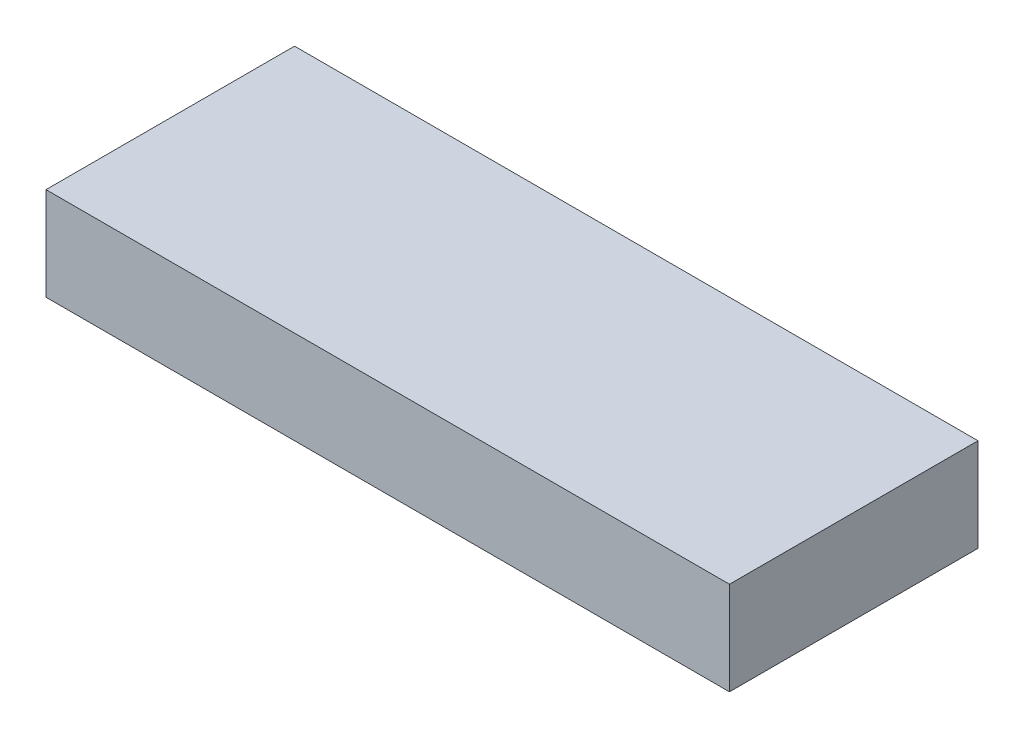
ISO-10303-21;
HEADER;
FILE_DESCRIPTION(('STEP AP214'),'2;1');
FILE_NAME('part.step','',(''),(''),'','','');
FILE_SCHEMA(('AUTOMOTIVE_DESIGN { 1 0 10303 214 1 1 1 1 }'));
ENDSEC;
DATA;
#1=APPLICATION_CONTEXT('core data for automotive mechanical design processes');
#2=APPLICATION_PROTOCOL_DEFINITION('international standard','automotive_design',2000,#1);
#3=PRODUCT_CONTEXT('',#1,'mechanical');
#4=PRODUCT('Part','Part','',(#3));
#5=PRODUCT_RELATED_PRODUCT_CATEGORY('part','',(#4));
#6=PRODUCT_DEFINITION_FORMATION('','',#4);
#7=PRODUCT_DEFINITION_CONTEXT('part definition',#1,'design');
#8=PRODUCT_DEFINITION('design','',#6,#7);
#9=PRODUCT_DEFINITION_SHAPE('','',#8);
#10=(LENGTH_UNIT() NAMED_UNIT(*) SI_UNIT(.MILLI.,.METRE.));
#11=(NAMED_UNIT(*) PLANE_ANGLE_UNIT() SI_UNIT($,.RADIAN.));
#12=(NAMED_UNIT(*) SI_UNIT($,.STERADIAN.) SOLID_ANGLE_UNIT());
#13=UNCERTAINTY_MEASURE_WITH_UNIT(LENGTH_MEASURE(1.E-05),#10,'distance_accuracy_value','');
#14=(GEOMETRIC_REPRESENTATION_CONTEXT(3) GLOBAL_UNCERTAINTY_ASSIGNED_CONTEXT((#13)) GLOBAL_UNIT_ASSIGNED_CONTEXT((#10,
#11,#12)) REPRESENTATION_CONTEXT('',''));
#15=CARTESIAN_POINT('',(0.,0.,0.));
#16=DIRECTION('',(0.,0.,1.));
#17=DIRECTION('',(1.,0.,0.));
#18=AXIS2_PLACEMENT_3D('',#15,#16,#17);
#19=CARTESIAN_POINT('',(-1100.,300.,400.));
#20=DIRECTION('',(1.,0.,0.));
#21=DIRECTION('',(0.,0.,-1.));
#22=AXIS2_PLACEMENT_3D('',#19,#20,#21);
#23=PLANE('',#22);
#24=DIRECTION('',(0.,0.,1.));
#25=VECTOR('',#24,1.);
#26=CARTESIAN_POINT('',(-1100.,0.,400.));
#27=LINE('',#26,#25);
#28=CARTESIAN_POINT('',(-1100.,0.,-400.));
#29=VERTEX_POINT('',#28);
#30=CARTESIAN_POINT('',(-1100.,0.,400.));
#31=VERTEX_POINT('',#30);
#32=EDGE_CURVE('E97',#29,#31,#27,.T.);
#33=ORIENTED_EDGE('',*,*,#32,.T.);
#34=DIRECTION('',(0.,-1.,0.));
#35=VECTOR('',#34,1.);
#36=CARTESIAN_POINT('',(-1100.,300.,400.));
#37=LINE('',#36,#35);
#38=CARTESIAN_POINT('',(-1100.,300.,400.));
#39=VERTEX_POINT('',#38);
#40=EDGE_CURVE('E11',#39,#31,#37,.T.);
#41=ORIENTED_EDGE('',*,*,#40,.F.);
#42=DIRECTION('',(0.,0.,1.));
#43=VECTOR('',#42,1.);
#44=CARTESIAN_POINT('',(-1100.,300.,400.));
#45=LINE('',#44,#43);
#46=CARTESIAN_POINT('',(-1100.,300.,-400.));
#47=VERTEX_POINT('',#46);
#48=EDGE_CURVE('E85',#47,#39,#45,.T.);
#49=ORIENTED_EDGE('',*,*,#48,.F.);
#50=DIRECTION('',(0.,-1.,0.));
#51=VECTOR('',#50,1.);
#52=CARTESIAN_POINT('',(-1100.,300.,-400.));
#53=LINE('',#52,#51);
#54=EDGE_CURVE('E93',#47,#29,#53,.T.);
#55=ORIENTED_EDGE('',*,*,#54,.T.);
#56=EDGE_LOOP('',(#33,#41,#49,#55));
#57=FACE_BOUND('',#56,.T.);
#58=ADVANCED_FACE('F34',(#57),#23,.F.);
#59=CARTESIAN_POINT('',(1100.,300.,400.));
#60=DIRECTION('',(0.,0.,-1.));
#61=DIRECTION('',(-1.,0.,0.));
#62=AXIS2_PLACEMENT_3D('',#59,#60,#61);
#63=PLANE('',#62);
#64=DIRECTION('',(1.,0.,0.));
#65=VECTOR('',#64,1.);
#66=CARTESIAN_POINT('',(1100.,0.,400.));
#67=LINE('',#66,#65);
#68=CARTESIAN_POINT('',(1100.,0.,400.));
#69=VERTEX_POINT('',#68);
#70=EDGE_CURVE('E89',#31,#69,#67,.T.);
#71=ORIENTED_EDGE('',*,*,#70,.T.);
#72=DIRECTION('',(0.,-1.,0.));
#73=VECTOR('',#72,1.);
#74=CARTESIAN_POINT('',(1100.,300.,400.));
#75=LINE('',#74,#73);
#76=CARTESIAN_POINT('',(1100.,300.,400.));
#77=VERTEX_POINT('',#76);
#78=EDGE_CURVE('E42',#77,#69,#75,.T.);
#79=ORIENTED_EDGE('',*,*,#78,.F.);
#80=DIRECTION('',(1.,0.,0.));
#81=VECTOR('',#80,1.);
#82=CARTESIAN_POINT('',(1100.,300.,400.));
#83=LINE('',#82,#81);
#84=EDGE_CURVE('E80',#39,#77,#83,.T.);
#85=ORIENTED_EDGE('',*,*,#84,.F.);
#86=ORIENTED_EDGE('',*,*,#40,.T.);
#87=EDGE_LOOP('',(#71,#79,#85,#86));
#88=FACE_BOUND('',#87,.T.);
#89=ADVANCED_FACE('F88',(#88),#63,.F.);
#90=CARTESIAN_POINT('',(1100.,300.,400.));
#91=DIRECTION('',(-1.,0.,0.));
#92=DIRECTION('',(0.,0.,1.));
#93=AXIS2_PLACEMENT_3D('',#90,#91,#92);
#94=PLANE('',#93);
#95=DIRECTION('',(0.,0.,-1.));
#96=VECTOR('',#95,1.);
#97=CARTESIAN_POINT('',(1100.,0.,400.));
#98=LINE('',#97,#96);
#99=CARTESIAN_POINT('',(1100.,0.,-400.));
#100=VERTEX_POINT('',#99);
#101=EDGE_CURVE('E67',#69,#100,#98,.T.);
#102=ORIENTED_EDGE('',*,*,#101,.T.);
#103=DIRECTION('',(0.,-1.,0.));
#104=VECTOR('',#103,1.);
#105=CARTESIAN_POINT('',(1100.,300.,-400.));
#106=LINE('',#105,#104);
#107=CARTESIAN_POINT('',(1100.,300.,-400.));
#108=VERTEX_POINT('',#107);
#109=EDGE_CURVE('E90',#108,#100,#106,.T.);
#110=ORIENTED_EDGE('',*,*,#109,.F.);
#111=DIRECTION('',(0.,0.,-1.));
#112=VECTOR('',#111,1.);
#113=CARTESIAN_POINT('',(1100.,300.,400.));
#114=LINE('',#113,#112);
#115=EDGE_CURVE('E83',#77,#108,#114,.T.);
#116=ORIENTED_EDGE('',*,*,#115,.F.);
#117=ORIENTED_EDGE('',*,*,#78,.T.);
#118=EDGE_LOOP('',(#102,#110,#116,#117));
#119=FACE_BOUND('',#118,.T.);
#120=ADVANCED_FACE('F91',(#119),#94,.F.);
#121=CARTESIAN_POINT('',(1100.,300.,-400.));
#122=DIRECTION('',(0.,0.,1.));
#123=DIRECTION('',(1.,0.,0.));
#124=AXIS2_PLACEMENT_3D('',#121,#122,#123);
#125=PLANE('',#124);
#126=DIRECTION('',(-1.,0.,0.));
#127=VECTOR('',#126,1.);
#128=CARTESIAN_POINT('',(1100.,0.,-400.));
#129=LINE('',#128,#127);
#130=EDGE_CURVE('E73',#100,#29,#129,.T.);
#131=ORIENTED_EDGE('',*,*,#130,.T.);
#132=ORIENTED_EDGE('',*,*,#54,.F.);
#133=DIRECTION('',(-1.,0.,0.));
#134=VECTOR('',#133,1.);
#135=CARTESIAN_POINT('',(1100.,300.,-400.));
#136=LINE('',#135,#134);
#137=EDGE_CURVE('E50',#108,#47,#136,.T.);
#138=ORIENTED_EDGE('',*,*,#137,.F.);
#139=ORIENTED_EDGE('',*,*,#109,.T.);
#140=EDGE_LOOP('',(#131,#132,#138,#139));
#141=FACE_BOUND('',#140,.T.);
#142=ADVANCED_FACE('F104',(#141),#125,.F.);
#143=CARTESIAN_POINT('',(0.,300.,0.));
#144=DIRECTION('',(0.,1.,0.));
#145=DIRECTION('',(0.,0.,1.));
#146=AXIS2_PLACEMENT_3D('',#143,#144,#145);
#147=PLANE('',#146);
#148=ORIENTED_EDGE('',*,*,#48,.T.);
#149=ORIENTED_EDGE('',*,*,#84,.T.);
#150=ORIENTED_EDGE('',*,*,#115,.T.);
#151=ORIENTED_EDGE('',*,*,#137,.T.);
#152=EDGE_LOOP('',(#148,#149,#150,#151));
#153=FACE_BOUND('',#152,.T.);
#154=ADVANCED_FACE('F81',(#153),#147,.T.);
#155=CARTESIAN_POINT('',(0.,0.,0.));
#156=DIRECTION('',(0.,1.,0.));
#157=DIRECTION('',(0.,0.,1.));
#158=AXIS2_PLACEMENT_3D('',#155,#156,#157);
#159=PLANE('',#158);
#160=ORIENTED_EDGE('',*,*,#32,.F.);
#161=ORIENTED_EDGE('',*,*,#130,.F.);
#162=ORIENTED_EDGE('',*,*,#101,.F.);
#163=ORIENTED_EDGE('',*,*,#70,.F.);
#164=EDGE_LOOP('',(#160,#161,#162,#163));
#165=FACE_BOUND('',#164,.T.);
#166=ADVANCED_FACE('F107',(#165),#159,.F.);
#167=CLOSED_SHELL('',(#58,#89,#120,#142,#154,#166));
#168=MANIFOLD_SOLID_BREP('B2',#167);
#169=ADVANCED_BREP_SHAPE_REPRESENTATION('',(#18,#168),#14);
#170=SHAPE_DEFINITION_REPRESENTATION(#9,#169);
ENDSEC;
END-ISO-10303-21;
